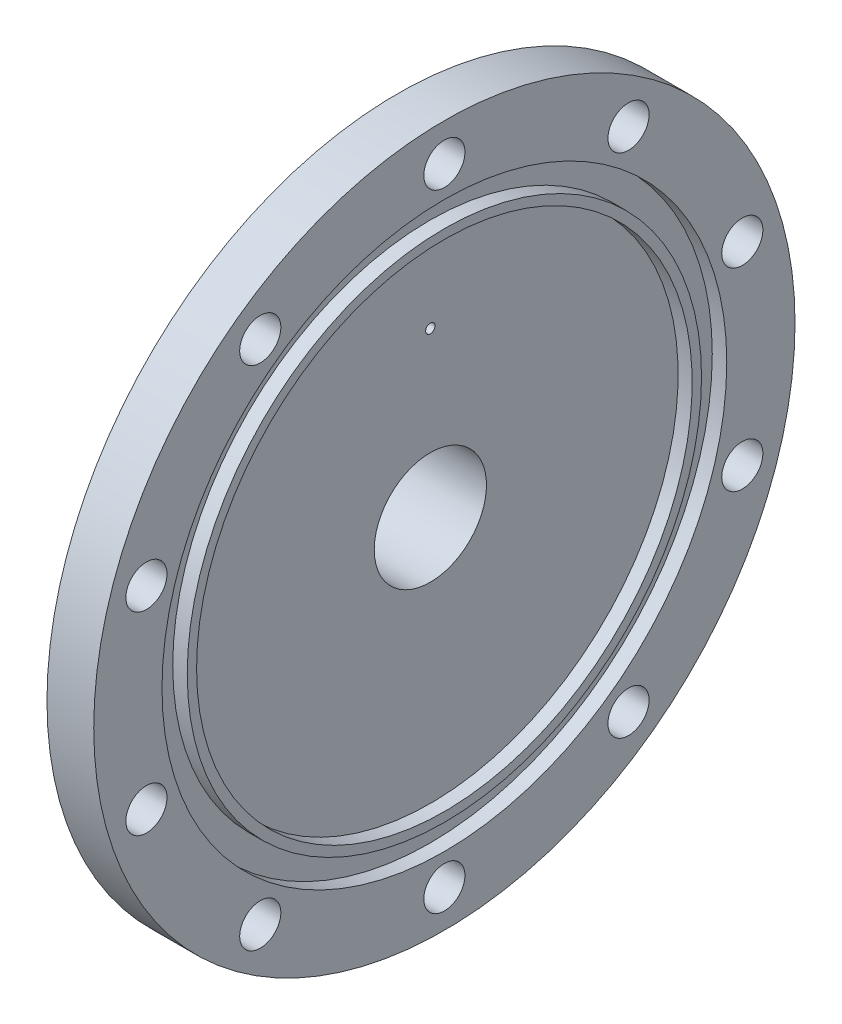
ISO-10303-21;
HEADER;
FILE_DESCRIPTION(('STEP AP214'),'2;1');
FILE_NAME('part.step','',(''),(''),'','','');
FILE_SCHEMA(('AUTOMOTIVE_DESIGN { 1 0 10303 214 1 1 1 1 }'));
ENDSEC;
DATA;
#1=APPLICATION_CONTEXT('core data for automotive mechanical design processes');
#2=APPLICATION_PROTOCOL_DEFINITION('international standard','automotive_design',2000,#1);
#3=PRODUCT_CONTEXT('',#1,'mechanical');
#4=PRODUCT('Part','Part','',(#3));
#5=PRODUCT_RELATED_PRODUCT_CATEGORY('part','',(#4));
#6=PRODUCT_DEFINITION_FORMATION('','',#4);
#7=PRODUCT_DEFINITION_CONTEXT('part definition',#1,'design');
#8=PRODUCT_DEFINITION('design','',#6,#7);
#9=PRODUCT_DEFINITION_SHAPE('','',#8);
#10=(LENGTH_UNIT() NAMED_UNIT(*) SI_UNIT(.MILLI.,.METRE.));
#11=(NAMED_UNIT(*) PLANE_ANGLE_UNIT() SI_UNIT($,.RADIAN.));
#12=(NAMED_UNIT(*) SI_UNIT($,.STERADIAN.) SOLID_ANGLE_UNIT());
#13=UNCERTAINTY_MEASURE_WITH_UNIT(LENGTH_MEASURE(1.E-05),#10,'distance_accuracy_value','');
#14=(GEOMETRIC_REPRESENTATION_CONTEXT(3) GLOBAL_UNCERTAINTY_ASSIGNED_CONTEXT((#13)) GLOBAL_UNIT_ASSIGNED_CONTEXT((#10,
#11,#12)) REPRESENTATION_CONTEXT('',''));
#15=CARTESIAN_POINT('',(0.,0.,0.));
#16=DIRECTION('',(0.,0.,1.));
#17=DIRECTION('',(1.,0.,0.));
#18=AXIS2_PLACEMENT_3D('',#15,#16,#17);
#19=CARTESIAN_POINT('',(0.,12.,0.));
#20=DIRECTION('',(1.,0.,0.));
#21=DIRECTION('',(0.,0.,-1.));
#22=AXIS2_PLACEMENT_3D('',#19,#20,#21);
#23=PLANE('',#22);
#24=CARTESIAN_POINT('',(0.,9.00000000000018,15.5884572681198));
#25=DIRECTION('',(-1.,0.,0.));
#26=DIRECTION('',(0.,-0.866025403784433,0.50000000000001));
#27=AXIS2_PLACEMENT_3D('',#24,#25,#26);
#28=CIRCLE('',#27,2.1);
#29=CARTESIAN_POINT('',(0.,7.18134665205287,16.6384572681198));
#30=VERTEX_POINT('',#29);
#31=EDGE_CURVE('E174',#30,#30,#28,.T.);
#32=ORIENTED_EDGE('',*,*,#31,.F.);
#33=EDGE_LOOP('',(#32));
#34=FACE_BOUND('',#33,.T.);
#35=CARTESIAN_POINT('',(0.,-8.99999999999985,15.58845726812));
#36=DIRECTION('',(-1.,0.,0.));
#37=DIRECTION('',(0.,-0.866025403784443,-0.499999999999992));
#38=AXIS2_PLACEMENT_3D('',#35,#36,#37);
#39=CIRCLE('',#38,2.1);
#40=CARTESIAN_POINT('',(0.,-10.8186533479472,14.53845726812));
#41=VERTEX_POINT('',#40);
#42=EDGE_CURVE('E191',#41,#41,#39,.T.);
#43=ORIENTED_EDGE('',*,*,#42,.F.);
#44=EDGE_LOOP('',(#43));
#45=FACE_BOUND('',#44,.T.);
#46=CARTESIAN_POINT('',(0.,-18.,0.));
#47=DIRECTION('',(-1.,0.,0.));
#48=DIRECTION('',(0.,0.,-1.));
#49=AXIS2_PLACEMENT_3D('',#46,#47,#48);
#50=CIRCLE('',#49,2.1);
#51=CARTESIAN_POINT('',(0.,-18.,-2.1));
#52=VERTEX_POINT('',#51);
#53=EDGE_CURVE('E185',#52,#52,#50,.T.);
#54=ORIENTED_EDGE('',*,*,#53,.F.);
#55=EDGE_LOOP('',(#54));
#56=FACE_BOUND('',#55,.T.);
#57=CARTESIAN_POINT('',(0.,-9.00000000000007,-15.5884572681199));
#58=DIRECTION('',(-1.,0.,0.));
#59=DIRECTION('',(0.,0.866025403784436,-0.500000000000004));
#60=AXIS2_PLACEMENT_3D('',#57,#58,#59);
#61=CIRCLE('',#60,2.1);
#62=CARTESIAN_POINT('',(0.,-7.18134665205276,-16.6384572681199));
#63=VERTEX_POINT('',#62);
#64=EDGE_CURVE('E179',#63,#63,#61,.T.);
#65=ORIENTED_EDGE('',*,*,#64,.F.);
#66=EDGE_LOOP('',(#65));
#67=FACE_BOUND('',#66,.T.);
#68=CARTESIAN_POINT('',(0.,8.99999999999996,-15.5884572681199));
#69=DIRECTION('',(-1.,0.,0.));
#70=DIRECTION('',(0.,0.86602540378444,0.499999999999998));
#71=AXIS2_PLACEMENT_3D('',#68,#69,#70);
#72=CIRCLE('',#71,2.1);
#73=CARTESIAN_POINT('',(0.,10.8186533479473,-14.5384572681199));
#74=VERTEX_POINT('',#73);
#75=EDGE_CURVE('E178',#74,#74,#72,.T.);
#76=ORIENTED_EDGE('',*,*,#75,.F.);
#77=EDGE_LOOP('',(#76));
#78=FACE_BOUND('',#77,.T.);
#79=CARTESIAN_POINT('',(0.,18.,0.));
#80=DIRECTION('',(-1.,0.,0.));
#81=DIRECTION('',(0.,0.,1.));
#82=AXIS2_PLACEMENT_3D('',#79,#80,#81);
#83=CIRCLE('',#82,2.1);
#84=CARTESIAN_POINT('',(0.,18.,2.1));
#85=VERTEX_POINT('',#84);
#86=EDGE_CURVE('E202',#85,#85,#83,.T.);
#87=ORIENTED_EDGE('',*,*,#86,.F.);
#88=EDGE_LOOP('',(#87));
#89=FACE_BOUND('',#88,.T.);
#90=CARTESIAN_POINT('',(0.,0.,0.));
#91=DIRECTION('',(-1.,0.,0.));
#92=DIRECTION('',(0.,0.,1.));
#93=AXIS2_PLACEMENT_3D('',#90,#91,#92);
#94=CIRCLE('',#93,12.);
#95=CARTESIAN_POINT('',(0.,0.,12.));
#96=VERTEX_POINT('',#95);
#97=EDGE_CURVE('E208',#96,#96,#94,.T.);
#98=ORIENTED_EDGE('',*,*,#97,.F.);
#99=EDGE_LOOP('',(#98));
#100=FACE_BOUND('',#99,.T.);
#101=CARTESIAN_POINT('',(0.,0.,0.));
#102=DIRECTION('',(-1.,0.,0.));
#103=DIRECTION('',(0.,0.,1.));
#104=AXIS2_PLACEMENT_3D('',#101,#102,#103);
#105=CIRCLE('',#104,24.);
#106=CARTESIAN_POINT('',(0.,9.94285714285715,-21.8435251696409));
#107=VERTEX_POINT('',#106);
#108=CARTESIAN_POINT('',(0.,9.94285714285715,21.8435251696409));
#109=VERTEX_POINT('',#108);
#110=EDGE_CURVE('E11',#107,#109,#105,.T.);
#111=ORIENTED_EDGE('',*,*,#110,.T.);
#112=DIRECTION('',(0.,0.91014688206837,-0.414285714285714));
#113=VECTOR('',#112,1.);
#114=CARTESIAN_POINT('',(0.,9.94285714285715,21.8435251696409));
#115=LINE('',#114,#113);
#116=CARTESIAN_POINT('',(0.,38.9357142857143,8.64639537964952));
#117=VERTEX_POINT('',#116);
#118=EDGE_CURVE('E78',#109,#117,#115,.T.);
#119=ORIENTED_EDGE('',*,*,#118,.T.);
#120=CARTESIAN_POINT('',(0.,35.,0.));
#121=DIRECTION('',(-1.,0.,0.));
#122=DIRECTION('',(0.,0.,1.));
#123=AXIS2_PLACEMENT_3D('',#120,#121,#122);
#124=CIRCLE('',#123,9.5);
#125=CARTESIAN_POINT('',(0.,38.9357142857143,-8.64639537964952));
#126=VERTEX_POINT('',#125);
#127=EDGE_CURVE('E82',#117,#126,#124,.T.);
#128=ORIENTED_EDGE('',*,*,#127,.T.);
#129=DIRECTION('',(0.,-0.91014688206837,-0.414285714285714));
#130=VECTOR('',#129,1.);
#131=CARTESIAN_POINT('',(0.,9.94285714285715,-21.8435251696409));
#132=LINE('',#131,#130);
#133=EDGE_CURVE('E99',#126,#107,#132,.T.);
#134=ORIENTED_EDGE('',*,*,#133,.T.);
#135=EDGE_LOOP('',(#111,#119,#128,#134));
#136=FACE_BOUND('',#135,.T.);
#137=CARTESIAN_POINT('',(0.,35.,0.));
#138=DIRECTION('',(-1.,0.,0.));
#139=DIRECTION('',(0.,0.,1.));
#140=AXIS2_PLACEMENT_3D('',#137,#138,#139);
#141=CIRCLE('',#140,5.5);
#142=CARTESIAN_POINT('',(0.,35.,5.5));
#143=VERTEX_POINT('',#142);
#144=EDGE_CURVE('E107',#143,#143,#141,.T.);
#145=ORIENTED_EDGE('',*,*,#144,.F.);
#146=EDGE_LOOP('',(#145));
#147=FACE_BOUND('',#146,.T.);
#148=ADVANCED_FACE('F41',(#34,#45,#56,#67,#78,#89,#100,#136,#147),#23,.F.);
#149=CARTESIAN_POINT('',(0.,0.,0.));
#150=DIRECTION('',(-1.,0.,0.));
#151=DIRECTION('',(0.,0.,1.));
#152=AXIS2_PLACEMENT_3D('',#149,#150,#151);
#153=CYLINDRICAL_SURFACE('',#152,24.);
#154=CARTESIAN_POINT('',(10.,0.,0.));
#155=DIRECTION('',(-1.,0.,0.));
#156=DIRECTION('',(0.,0.,1.));
#157=AXIS2_PLACEMENT_3D('',#154,#155,#156);
#158=CIRCLE('',#157,24.);
#159=CARTESIAN_POINT('',(10.,9.94285714285715,-21.8435251696409));
#160=VERTEX_POINT('',#159);
#161=CARTESIAN_POINT('',(10.,9.94285714285716,21.8435251696409));
#162=VERTEX_POINT('',#161);
#163=EDGE_CURVE('E48',#160,#162,#158,.T.);
#164=ORIENTED_EDGE('',*,*,#163,.T.);
#165=DIRECTION('',(1.,0.,0.));
#166=VECTOR('',#165,1.);
#167=CARTESIAN_POINT('',(0.,9.94285714285715,21.8435251696409));
#168=LINE('',#167,#166);
#169=EDGE_CURVE('E58',#109,#162,#168,.T.);
#170=ORIENTED_EDGE('',*,*,#169,.F.);
#171=ORIENTED_EDGE('',*,*,#110,.F.);
#172=DIRECTION('',(1.,0.,0.));
#173=VECTOR('',#172,1.);
#174=CARTESIAN_POINT('',(0.,9.94285714285715,-21.8435251696409));
#175=LINE('',#174,#173);
#176=EDGE_CURVE('E101',#107,#160,#175,.T.);
#177=ORIENTED_EDGE('',*,*,#176,.T.);
#178=EDGE_LOOP('',(#164,#170,#171,#177));
#179=FACE_BOUND('',#178,.T.);
#180=ADVANCED_FACE('F239',(#179),#153,.T.);
#181=CARTESIAN_POINT('',(10.,24.,0.));
#182=DIRECTION('',(1.,0.,0.));
#183=DIRECTION('',(0.,0.,-1.));
#184=AXIS2_PLACEMENT_3D('',#181,#182,#183);
#185=PLANE('',#184);
#186=DIRECTION('',(0.,0.91014688206837,-0.414285714285714));
#187=VECTOR('',#186,1.);
#188=CARTESIAN_POINT('',(10.,9.94285714285715,21.8435251696409));
#189=LINE('',#188,#187);
#190=CARTESIAN_POINT('',(10.,38.9357142857143,8.64639537964952));
#191=VERTEX_POINT('',#190);
#192=EDGE_CURVE('E91',#162,#191,#189,.T.);
#193=ORIENTED_EDGE('',*,*,#192,.F.);
#194=ORIENTED_EDGE('',*,*,#163,.F.);
#195=DIRECTION('',(0.,-0.91014688206837,-0.414285714285714));
#196=VECTOR('',#195,1.);
#197=CARTESIAN_POINT('',(10.,9.94285714285715,-21.8435251696409));
#198=LINE('',#197,#196);
#199=CARTESIAN_POINT('',(10.,38.9357142857143,-8.64639537964951));
#200=VERTEX_POINT('',#199);
#201=EDGE_CURVE('E85',#200,#160,#198,.T.);
#202=ORIENTED_EDGE('',*,*,#201,.F.);
#203=CARTESIAN_POINT('',(10.,35.,0.));
#204=DIRECTION('',(-1.,0.,0.));
#205=DIRECTION('',(0.,0.,1.));
#206=AXIS2_PLACEMENT_3D('',#203,#204,#205);
#207=CIRCLE('',#206,9.5);
#208=EDGE_CURVE('E106',#191,#200,#207,.T.);
#209=ORIENTED_EDGE('',*,*,#208,.F.);
#210=EDGE_LOOP('',(#193,#194,#202,#209));
#211=FACE_BOUND('',#210,.T.);
#212=CARTESIAN_POINT('',(10.,54.204138623122,39.381611903595));
#213=DIRECTION('',(-1.,0.,0.));
#214=DIRECTION('',(0.,-0.587785252292462,0.809016994374955));
#215=AXIS2_PLACEMENT_3D('',#212,#213,#214);
#216=CIRCLE('',#215,4.4);
#217=CARTESIAN_POINT('',(10.,51.6178835130352,42.9412866788448));
#218=VERTEX_POINT('',#217);
#219=EDGE_CURVE('E114',#218,#218,#216,.T.);
#220=ORIENTED_EDGE('',*,*,#219,.F.);
#221=EDGE_LOOP('',(#220));
#222=FACE_BOUND('',#221,.T.);
#223=CARTESIAN_POINT('',(10.,20.7041386231222,63.7207865917751));
#224=DIRECTION('',(-1.,0.,0.));
#225=DIRECTION('',(0.,-0.95105651629515,0.309016994374958));
#226=AXIS2_PLACEMENT_3D('',#223,#224,#225);
#227=CIRCLE('',#226,4.4);
#228=CARTESIAN_POINT('',(10.,16.5194899514235,65.0804613670249));
#229=VERTEX_POINT('',#228);
#230=EDGE_CURVE('E153',#229,#229,#227,.T.);
#231=ORIENTED_EDGE('',*,*,#230,.F.);
#232=EDGE_LOOP('',(#231));
#233=FACE_BOUND('',#232,.T.);
#234=CARTESIAN_POINT('',(10.,-20.7041386231209,63.7207865917755));
#235=DIRECTION('',(-1.,0.,0.));
#236=DIRECTION('',(0.,-0.951056516295157,-0.309016994374938));
#237=AXIS2_PLACEMENT_3D('',#234,#235,#236);
#238=CIRCLE('',#237,4.4);
#239=CARTESIAN_POINT('',(10.,-24.8887872948196,62.3611118165258));
#240=VERTEX_POINT('',#239);
#241=EDGE_CURVE('E147',#240,#240,#238,.T.);
#242=ORIENTED_EDGE('',*,*,#241,.F.);
#243=EDGE_LOOP('',(#242));
#244=FACE_BOUND('',#243,.T.);
#245=CARTESIAN_POINT('',(10.,-54.2041386231211,39.3816119035962));
#246=DIRECTION('',(-1.,0.,0.));
#247=DIRECTION('',(0.,-0.58778525229248,-0.809016994374942));
#248=AXIS2_PLACEMENT_3D('',#245,#246,#247);
#249=CIRCLE('',#248,4.4);
#250=CARTESIAN_POINT('',(10.,-56.790393733208,35.8219371283464));
#251=VERTEX_POINT('',#250);
#252=EDGE_CURVE('E141',#251,#251,#249,.T.);
#253=ORIENTED_EDGE('',*,*,#252,.F.);
#254=EDGE_LOOP('',(#253));
#255=FACE_BOUND('',#254,.T.);
#256=CARTESIAN_POINT('',(10.,-67.,0.));
#257=DIRECTION('',(-1.,0.,0.));
#258=DIRECTION('',(0.,0.,-1.));
#259=AXIS2_PLACEMENT_3D('',#256,#257,#258);
#260=CIRCLE('',#259,4.4);
#261=CARTESIAN_POINT('',(10.,-67.,-4.4));
#262=VERTEX_POINT('',#261);
#263=EDGE_CURVE('E135',#262,#262,#260,.T.);
#264=ORIENTED_EDGE('',*,*,#263,.F.);
#265=EDGE_LOOP('',(#264));
#266=FACE_BOUND('',#265,.T.);
#267=CARTESIAN_POINT('',(10.,-54.2041386231217,-39.3816119035954));
#268=DIRECTION('',(-1.,0.,0.));
#269=DIRECTION('',(0.,0.587785252292469,-0.809016994374951));
#270=AXIS2_PLACEMENT_3D('',#267,#268,#269);
#271=CIRCLE('',#270,4.4);
#272=CARTESIAN_POINT('',(10.,-51.6178835130348,-42.9412866788452));
#273=VERTEX_POINT('',#272);
#274=EDGE_CURVE('E129',#273,#273,#271,.T.);
#275=ORIENTED_EDGE('',*,*,#274,.F.);
#276=EDGE_LOOP('',(#275));
#277=FACE_BOUND('',#276,.T.);
#278=CARTESIAN_POINT('',(10.,-20.7041386231218,-63.7207865917752));
#279=DIRECTION('',(-1.,0.,0.));
#280=DIRECTION('',(0.,0.951056516295152,-0.309016994374952));
#281=AXIS2_PLACEMENT_3D('',#278,#279,#280);
#282=CIRCLE('',#281,4.4);
#283=CARTESIAN_POINT('',(10.,-16.5194899514231,-65.080461367025));
#284=VERTEX_POINT('',#283);
#285=EDGE_CURVE('E123',#284,#284,#282,.T.);
#286=ORIENTED_EDGE('',*,*,#285,.F.);
#287=EDGE_LOOP('',(#286));
#288=FACE_BOUND('',#287,.T.);
#289=CARTESIAN_POINT('',(10.,20.7041386231213,-63.7207865917754));
#290=DIRECTION('',(-1.,0.,0.));
#291=DIRECTION('',(0.,0.951056516295155,0.309016994374945));
#292=AXIS2_PLACEMENT_3D('',#289,#290,#291);
#293=CIRCLE('',#292,4.4);
#294=CARTESIAN_POINT('',(10.,24.88878729482,-62.3611118165256));
#295=VERTEX_POINT('',#294);
#296=EDGE_CURVE('E115',#295,#295,#293,.T.);
#297=ORIENTED_EDGE('',*,*,#296,.F.);
#298=EDGE_LOOP('',(#297));
#299=FACE_BOUND('',#298,.T.);
#300=CARTESIAN_POINT('',(10.,54.2041386231214,-39.3816119035958));
#301=DIRECTION('',(-1.,0.,0.));
#302=DIRECTION('',(0.,0.587785252292474,0.809016994374947));
#303=AXIS2_PLACEMENT_3D('',#300,#301,#302);
#304=CIRCLE('',#303,4.4);
#305=CARTESIAN_POINT('',(10.,56.7903937332083,-35.821937128346));
#306=VERTEX_POINT('',#305);
#307=EDGE_CURVE('E122',#306,#306,#304,.T.);
#308=ORIENTED_EDGE('',*,*,#307,.F.);
#309=EDGE_LOOP('',(#308));
#310=FACE_BOUND('',#309,.T.);
#311=CARTESIAN_POINT('',(10.,67.,0.));
#312=DIRECTION('',(-1.,0.,0.));
#313=DIRECTION('',(0.,0.,1.));
#314=AXIS2_PLACEMENT_3D('',#311,#312,#313);
#315=CIRCLE('',#314,4.4);
#316=CARTESIAN_POINT('',(10.,67.,4.4));
#317=VERTEX_POINT('',#316);
#318=EDGE_CURVE('E168',#317,#317,#315,.T.);
#319=ORIENTED_EDGE('',*,*,#318,.F.);
#320=EDGE_LOOP('',(#319));
#321=FACE_BOUND('',#320,.T.);
#322=CARTESIAN_POINT('',(10.,0.,0.));
#323=DIRECTION('',(-1.,0.,0.));
#324=DIRECTION('',(0.,0.,1.));
#325=AXIS2_PLACEMENT_3D('',#322,#323,#324);
#326=CIRCLE('',#325,75.);
#327=CARTESIAN_POINT('',(10.,0.,75.));
#328=VERTEX_POINT('',#327);
#329=EDGE_CURVE('E237',#328,#328,#326,.T.);
#330=ORIENTED_EDGE('',*,*,#329,.T.);
#331=EDGE_LOOP('',(#330));
#332=FACE_BOUND('',#331,.T.);
#333=ADVANCED_FACE('F242',(#211,#222,#233,#244,#255,#266,#277,#288,#299,#310,#321,#332),#185,.F.);
#334=CARTESIAN_POINT('',(0.,0.,0.));
#335=DIRECTION('',(-1.,0.,0.));
#336=DIRECTION('',(0.,0.,1.));
#337=AXIS2_PLACEMENT_3D('',#334,#335,#336);
#338=CYLINDRICAL_SURFACE('',#337,75.);
#339=ORIENTED_EDGE('',*,*,#329,.F.);
#340=EDGE_LOOP('',(#339));
#341=FACE_BOUND('',#340,.T.);
#342=CARTESIAN_POINT('',(20.,0.,0.));
#343=DIRECTION('',(-1.,0.,0.));
#344=DIRECTION('',(0.,0.,1.));
#345=AXIS2_PLACEMENT_3D('',#342,#343,#344);
#346=CIRCLE('',#345,75.);
#347=CARTESIAN_POINT('',(20.,0.,75.));
#348=VERTEX_POINT('',#347);
#349=EDGE_CURVE('E234',#348,#348,#346,.T.);
#350=ORIENTED_EDGE('',*,*,#349,.T.);
#351=EDGE_LOOP('',(#350));
#352=FACE_BOUND('',#351,.T.);
#353=ADVANCED_FACE('F318',(#341,#352),#338,.T.);
#354=CARTESIAN_POINT('',(20.,75.,0.));
#355=DIRECTION('',(-1.,0.,0.));
#356=DIRECTION('',(0.,0.,1.));
#357=AXIS2_PLACEMENT_3D('',#354,#355,#356);
#358=PLANE('',#357);
#359=CARTESIAN_POINT('',(20.,54.204138623122,39.381611903595));
#360=DIRECTION('',(-1.,0.,0.));
#361=DIRECTION('',(0.,0.,1.));
#362=AXIS2_PLACEMENT_3D('',#359,#360,#361);
#363=CIRCLE('',#362,4.4);
#364=CARTESIAN_POINT('',(20.,54.204138623122,43.781611903595));
#365=VERTEX_POINT('',#364);
#366=EDGE_CURVE('E156',#365,#365,#363,.F.);
#367=ORIENTED_EDGE('',*,*,#366,.F.);
#368=EDGE_LOOP('',(#367));
#369=FACE_BOUND('',#368,.T.);
#370=CARTESIAN_POINT('',(20.,20.7041386231222,63.7207865917751));
#371=DIRECTION('',(-1.,0.,0.));
#372=DIRECTION('',(0.,0.,1.));
#373=AXIS2_PLACEMENT_3D('',#370,#371,#372);
#374=CIRCLE('',#373,4.4);
#375=CARTESIAN_POINT('',(20.,20.7041386231222,68.1207865917751));
#376=VERTEX_POINT('',#375);
#377=EDGE_CURVE('E150',#376,#376,#374,.F.);
#378=ORIENTED_EDGE('',*,*,#377,.F.);
#379=EDGE_LOOP('',(#378));
#380=FACE_BOUND('',#379,.T.);
#381=CARTESIAN_POINT('',(20.,-20.7041386231209,63.7207865917755));
#382=DIRECTION('',(-1.,0.,0.));
#383=DIRECTION('',(0.,0.,1.));
#384=AXIS2_PLACEMENT_3D('',#381,#382,#383);
#385=CIRCLE('',#384,4.4);
#386=CARTESIAN_POINT('',(20.,-20.7041386231209,68.1207865917755));
#387=VERTEX_POINT('',#386);
#388=EDGE_CURVE('E144',#387,#387,#385,.F.);
#389=ORIENTED_EDGE('',*,*,#388,.F.);
#390=EDGE_LOOP('',(#389));
#391=FACE_BOUND('',#390,.T.);
#392=CARTESIAN_POINT('',(20.,-54.2041386231211,39.3816119035962));
#393=DIRECTION('',(-1.,0.,0.));
#394=DIRECTION('',(0.,0.,1.));
#395=AXIS2_PLACEMENT_3D('',#392,#393,#394);
#396=CIRCLE('',#395,4.4);
#397=CARTESIAN_POINT('',(20.,-54.2041386231211,43.7816119035962));
#398=VERTEX_POINT('',#397);
#399=EDGE_CURVE('E138',#398,#398,#396,.F.);
#400=ORIENTED_EDGE('',*,*,#399,.F.);
#401=EDGE_LOOP('',(#400));
#402=FACE_BOUND('',#401,.T.);
#403=CARTESIAN_POINT('',(20.,-67.,0.));
#404=DIRECTION('',(-1.,0.,0.));
#405=DIRECTION('',(0.,0.,1.));
#406=AXIS2_PLACEMENT_3D('',#403,#404,#405);
#407=CIRCLE('',#406,4.4);
#408=CARTESIAN_POINT('',(20.,-67.,4.4));
#409=VERTEX_POINT('',#408);
#410=EDGE_CURVE('E132',#409,#409,#407,.F.);
#411=ORIENTED_EDGE('',*,*,#410,.F.);
#412=EDGE_LOOP('',(#411));
#413=FACE_BOUND('',#412,.T.);
#414=CARTESIAN_POINT('',(20.,-54.2041386231217,-39.3816119035954));
#415=DIRECTION('',(-1.,0.,0.));
#416=DIRECTION('',(0.,0.,1.));
#417=AXIS2_PLACEMENT_3D('',#414,#415,#416);
#418=CIRCLE('',#417,4.4);
#419=CARTESIAN_POINT('',(20.,-54.2041386231217,-34.9816119035954));
#420=VERTEX_POINT('',#419);
#421=EDGE_CURVE('E126',#420,#420,#418,.F.);
#422=ORIENTED_EDGE('',*,*,#421,.F.);
#423=EDGE_LOOP('',(#422));
#424=FACE_BOUND('',#423,.T.);
#425=CARTESIAN_POINT('',(20.,-20.7041386231218,-63.7207865917752));
#426=DIRECTION('',(-1.,0.,0.));
#427=DIRECTION('',(0.,0.,1.));
#428=AXIS2_PLACEMENT_3D('',#425,#426,#427);
#429=CIRCLE('',#428,4.4);
#430=CARTESIAN_POINT('',(20.,-20.7041386231218,-59.3207865917752));
#431=VERTEX_POINT('',#430);
#432=EDGE_CURVE('E119',#431,#431,#429,.F.);
#433=ORIENTED_EDGE('',*,*,#432,.F.);
#434=EDGE_LOOP('',(#433));
#435=FACE_BOUND('',#434,.T.);
#436=CARTESIAN_POINT('',(20.,20.7041386231213,-63.7207865917754));
#437=DIRECTION('',(-1.,0.,0.));
#438=DIRECTION('',(0.,0.,1.));
#439=AXIS2_PLACEMENT_3D('',#436,#437,#438);
#440=CIRCLE('',#439,4.4);
#441=CARTESIAN_POINT('',(20.,20.7041386231213,-59.3207865917754));
#442=VERTEX_POINT('',#441);
#443=EDGE_CURVE('E118',#442,#442,#440,.F.);
#444=ORIENTED_EDGE('',*,*,#443,.F.);
#445=EDGE_LOOP('',(#444));
#446=FACE_BOUND('',#445,.T.);
#447=CARTESIAN_POINT('',(20.,54.2041386231214,-39.3816119035958));
#448=DIRECTION('',(-1.,0.,0.));
#449=DIRECTION('',(0.,0.,1.));
#450=AXIS2_PLACEMENT_3D('',#447,#448,#449);
#451=CIRCLE('',#450,4.4);
#452=CARTESIAN_POINT('',(20.,54.2041386231214,-34.9816119035958));
#453=VERTEX_POINT('',#452);
#454=EDGE_CURVE('E165',#453,#453,#451,.F.);
#455=ORIENTED_EDGE('',*,*,#454,.F.);
#456=EDGE_LOOP('',(#455));
#457=FACE_BOUND('',#456,.T.);
#458=CARTESIAN_POINT('',(20.,67.,0.));
#459=DIRECTION('',(-1.,0.,0.));
#460=DIRECTION('',(0.,0.,1.));
#461=AXIS2_PLACEMENT_3D('',#458,#459,#460);
#462=CIRCLE('',#461,4.4);
#463=CARTESIAN_POINT('',(20.,67.,4.4));
#464=VERTEX_POINT('',#463);
#465=EDGE_CURVE('E171',#464,#464,#462,.F.);
#466=ORIENTED_EDGE('',*,*,#465,.F.);
#467=EDGE_LOOP('',(#466));
#468=FACE_BOUND('',#467,.T.);
#469=ORIENTED_EDGE('',*,*,#349,.F.);
#470=EDGE_LOOP('',(#469));
#471=FACE_BOUND('',#470,.T.);
#472=CARTESIAN_POINT('',(20.,0.,0.));
#473=DIRECTION('',(-1.,0.,0.));
#474=DIRECTION('',(0.,0.,1.));
#475=AXIS2_PLACEMENT_3D('',#472,#473,#474);
#476=CIRCLE('',#475,60.4);
#477=CARTESIAN_POINT('',(20.,0.,60.4));
#478=VERTEX_POINT('',#477);
#479=EDGE_CURVE('E231',#478,#478,#476,.T.);
#480=ORIENTED_EDGE('',*,*,#479,.T.);
#481=EDGE_LOOP('',(#480));
#482=FACE_BOUND('',#481,.T.);
#483=ADVANCED_FACE('F314',(#369,#380,#391,#402,#413,#424,#435,#446,#457,#468,#471,#482),#358,.F.);
#484=CARTESIAN_POINT('',(0.,0.,0.));
#485=DIRECTION('',(-1.,0.,0.));
#486=DIRECTION('',(0.,0.,1.));
#487=AXIS2_PLACEMENT_3D('',#484,#485,#486);
#488=CYLINDRICAL_SURFACE('',#487,60.4);
#489=ORIENTED_EDGE('',*,*,#479,.F.);
#490=EDGE_LOOP('',(#489));
#491=FACE_BOUND('',#490,.T.);
#492=CARTESIAN_POINT('',(16.9,0.,0.));
#493=DIRECTION('',(-1.,0.,0.));
#494=DIRECTION('',(0.,0.,1.));
#495=AXIS2_PLACEMENT_3D('',#492,#493,#494);
#496=CIRCLE('',#495,60.4);
#497=CARTESIAN_POINT('',(16.9,0.,60.4));
#498=VERTEX_POINT('',#497);
#499=EDGE_CURVE('E228',#498,#498,#496,.T.);
#500=ORIENTED_EDGE('',*,*,#499,.T.);
#501=EDGE_LOOP('',(#500));
#502=FACE_BOUND('',#501,.T.);
#503=ADVANCED_FACE('F310',(#491,#502),#488,.F.);
#504=CARTESIAN_POINT('',(16.9,55.,0.));
#505=DIRECTION('',(-1.,0.,0.));
#506=DIRECTION('',(0.,0.,1.));
#507=AXIS2_PLACEMENT_3D('',#504,#505,#506);
#508=PLANE('',#507);
#509=ORIENTED_EDGE('',*,*,#499,.F.);
#510=EDGE_LOOP('',(#509));
#511=FACE_BOUND('',#510,.T.);
#512=CARTESIAN_POINT('',(16.9,0.,0.));
#513=DIRECTION('',(-1.,0.,0.));
#514=DIRECTION('',(0.,0.,1.));
#515=AXIS2_PLACEMENT_3D('',#512,#513,#514);
#516=CIRCLE('',#515,55.);
#517=CARTESIAN_POINT('',(16.9,0.,55.));
#518=VERTEX_POINT('',#517);
#519=EDGE_CURVE('E225',#518,#518,#516,.T.);
#520=ORIENTED_EDGE('',*,*,#519,.T.);
#521=EDGE_LOOP('',(#520));
#522=FACE_BOUND('',#521,.T.);
#523=ADVANCED_FACE('F306',(#511,#522),#508,.F.);
#524=CARTESIAN_POINT('',(0.,0.,0.));
#525=DIRECTION('',(-1.,0.,0.));
#526=DIRECTION('',(0.,0.,1.));
#527=AXIS2_PLACEMENT_3D('',#524,#525,#526);
#528=CYLINDRICAL_SURFACE('',#527,55.);
#529=ORIENTED_EDGE('',*,*,#519,.F.);
#530=EDGE_LOOP('',(#529));
#531=FACE_BOUND('',#530,.T.);
#532=CARTESIAN_POINT('',(20.,0.,0.));
#533=DIRECTION('',(-1.,0.,0.));
#534=DIRECTION('',(0.,0.,1.));
#535=AXIS2_PLACEMENT_3D('',#532,#533,#534);
#536=CIRCLE('',#535,55.);
#537=CARTESIAN_POINT('',(20.,0.,55.));
#538=VERTEX_POINT('',#537);
#539=EDGE_CURVE('E222',#538,#538,#536,.T.);
#540=ORIENTED_EDGE('',*,*,#539,.T.);
#541=EDGE_LOOP('',(#540));
#542=FACE_BOUND('',#541,.T.);
#543=ADVANCED_FACE('F302',(#531,#542),#528,.T.);
#544=CARTESIAN_POINT('',(20.,55.,0.));
#545=DIRECTION('',(-1.,0.,0.));
#546=DIRECTION('',(0.,0.,1.));
#547=AXIS2_PLACEMENT_3D('',#544,#545,#546);
#548=PLANE('',#547);
#549=ORIENTED_EDGE('',*,*,#539,.F.);
#550=EDGE_LOOP('',(#549));
#551=FACE_BOUND('',#550,.T.);
#552=CARTESIAN_POINT('',(20.,0.,0.));
#553=DIRECTION('',(-1.,0.,0.));
#554=DIRECTION('',(0.,0.,1.));
#555=AXIS2_PLACEMENT_3D('',#552,#553,#554);
#556=CIRCLE('',#555,53.);
#557=CARTESIAN_POINT('',(20.,0.,53.));
#558=VERTEX_POINT('',#557);
#559=EDGE_CURVE('E219',#558,#558,#556,.T.);
#560=ORIENTED_EDGE('',*,*,#559,.T.);
#561=EDGE_LOOP('',(#560));
#562=FACE_BOUND('',#561,.T.);
#563=ADVANCED_FACE('F298',(#551,#562),#548,.F.);
#564=CARTESIAN_POINT('',(0.,0.,0.));
#565=DIRECTION('',(-1.,0.,0.));
#566=DIRECTION('',(0.,0.,1.));
#567=AXIS2_PLACEMENT_3D('',#564,#565,#566);
#568=CYLINDRICAL_SURFACE('',#567,53.);
#569=ORIENTED_EDGE('',*,*,#559,.F.);
#570=EDGE_LOOP('',(#569));
#571=FACE_BOUND('',#570,.T.);
#572=CARTESIAN_POINT('',(17.,0.,0.));
#573=DIRECTION('',(-1.,0.,0.));
#574=DIRECTION('',(0.,0.,1.));
#575=AXIS2_PLACEMENT_3D('',#572,#573,#574);
#576=CIRCLE('',#575,53.);
#577=CARTESIAN_POINT('',(17.,0.,53.));
#578=VERTEX_POINT('',#577);
#579=EDGE_CURVE('E216',#578,#578,#576,.T.);
#580=ORIENTED_EDGE('',*,*,#579,.T.);
#581=EDGE_LOOP('',(#580));
#582=FACE_BOUND('',#581,.T.);
#583=ADVANCED_FACE('F291',(#571,#582),#568,.F.);
#584=CARTESIAN_POINT('',(17.,53.,0.));
#585=DIRECTION('',(-1.,0.,0.));
#586=DIRECTION('',(0.,0.,1.));
#587=AXIS2_PLACEMENT_3D('',#584,#585,#586);
#588=PLANE('',#587);
#589=CARTESIAN_POINT('',(17.,35.,0.));
#590=DIRECTION('',(-1.,0.,0.));
#591=DIRECTION('',(0.,0.,1.));
#592=AXIS2_PLACEMENT_3D('',#589,#590,#591);
#593=CIRCLE('',#592,1.);
#594=CARTESIAN_POINT('',(17.,35.,1.));
#595=VERTEX_POINT('',#594);
#596=EDGE_CURVE('E384',#595,#595,#593,.F.);
#597=ORIENTED_EDGE('',*,*,#596,.F.);
#598=EDGE_LOOP('',(#597));
#599=FACE_BOUND('',#598,.T.);
#600=ORIENTED_EDGE('',*,*,#579,.F.);
#601=EDGE_LOOP('',(#600));
#602=FACE_BOUND('',#601,.T.);
#603=CARTESIAN_POINT('',(17.,0.,0.));
#604=DIRECTION('',(-1.,0.,0.));
#605=DIRECTION('',(0.,0.,1.));
#606=AXIS2_PLACEMENT_3D('',#603,#604,#605);
#607=CIRCLE('',#606,12.);
#608=CARTESIAN_POINT('',(17.,0.,12.));
#609=VERTEX_POINT('',#608);
#610=EDGE_CURVE('E213',#609,#609,#607,.T.);
#611=ORIENTED_EDGE('',*,*,#610,.T.);
#612=EDGE_LOOP('',(#611));
#613=FACE_BOUND('',#612,.T.);
#614=ADVANCED_FACE('F280',(#599,#602,#613),#588,.F.);
#615=CARTESIAN_POINT('',(0.,0.,0.));
#616=DIRECTION('',(-1.,0.,0.));
#617=DIRECTION('',(0.,0.,1.));
#618=AXIS2_PLACEMENT_3D('',#615,#616,#617);
#619=CYLINDRICAL_SURFACE('',#618,12.);
#620=ORIENTED_EDGE('',*,*,#610,.F.);
#621=EDGE_LOOP('',(#620));
#622=FACE_BOUND('',#621,.T.);
#623=ORIENTED_EDGE('',*,*,#97,.T.);
#624=EDGE_LOOP('',(#623));
#625=FACE_BOUND('',#624,.T.);
#626=ADVANCED_FACE('F277',(#622,#625),#619,.F.);
#627=CARTESIAN_POINT('',(6.,18.,0.));
#628=DIRECTION('',(-1.,0.,0.));
#629=DIRECTION('',(0.,0.,1.));
#630=AXIS2_PLACEMENT_3D('',#627,#628,#629);
#631=CYLINDRICAL_SURFACE('',#630,2.1);
#632=CARTESIAN_POINT('',(6.,18.,0.));
#633=DIRECTION('',(-1.,0.,0.));
#634=DIRECTION('',(0.,0.,1.));
#635=AXIS2_PLACEMENT_3D('',#632,#633,#634);
#636=CIRCLE('',#635,2.1);
#637=CARTESIAN_POINT('',(6.,18.,2.1));
#638=VERTEX_POINT('',#637);
#639=EDGE_CURVE('E205',#638,#638,#636,.T.);
#640=ORIENTED_EDGE('',*,*,#639,.F.);
#641=EDGE_LOOP('',(#640));
#642=FACE_BOUND('',#641,.T.);
#643=ORIENTED_EDGE('',*,*,#86,.T.);
#644=EDGE_LOOP('',(#643));
#645=FACE_BOUND('',#644,.T.);
#646=ADVANCED_FACE('F279',(#642,#645),#631,.F.);
#647=CARTESIAN_POINT('',(6.,18.,0.));
#648=DIRECTION('',(-1.,0.,0.));
#649=DIRECTION('',(0.,0.,1.));
#650=AXIS2_PLACEMENT_3D('',#647,#648,#649);
#651=PLANE('',#650);
#652=ORIENTED_EDGE('',*,*,#639,.T.);
#653=EDGE_LOOP('',(#652));
#654=FACE_BOUND('',#653,.T.);
#655=ADVANCED_FACE('F287',(#654),#651,.T.);
#656=CARTESIAN_POINT('',(6.,8.99999999999996,-15.5884572681199));
#657=DIRECTION('',(-1.,0.,0.));
#658=DIRECTION('',(0.,0.,1.));
#659=AXIS2_PLACEMENT_3D('',#656,#657,#658);
#660=CYLINDRICAL_SURFACE('',#659,2.1);
#661=CARTESIAN_POINT('',(6.,8.99999999999996,-15.5884572681199));
#662=DIRECTION('',(-1.,0.,0.));
#663=DIRECTION('',(0.,0.86602540378444,0.499999999999998));
#664=AXIS2_PLACEMENT_3D('',#661,#662,#663);
#665=CIRCLE('',#664,2.1);
#666=CARTESIAN_POINT('',(6.,10.8186533479473,-14.5384572681199));
#667=VERTEX_POINT('',#666);
#668=EDGE_CURVE('E199',#667,#667,#665,.T.);
#669=ORIENTED_EDGE('',*,*,#668,.F.);
#670=EDGE_LOOP('',(#669));
#671=FACE_BOUND('',#670,.T.);
#672=ORIENTED_EDGE('',*,*,#75,.T.);
#673=EDGE_LOOP('',(#672));
#674=FACE_BOUND('',#673,.T.);
#675=ADVANCED_FACE('F426',(#671,#674),#660,.F.);
#676=CARTESIAN_POINT('',(6.,8.99999999999996,-15.5884572681199));
#677=DIRECTION('',(-1.,0.,0.));
#678=DIRECTION('',(0.,0.86602540378444,0.499999999999998));
#679=AXIS2_PLACEMENT_3D('',#676,#677,#678);
#680=PLANE('',#679);
#681=ORIENTED_EDGE('',*,*,#668,.T.);
#682=EDGE_LOOP('',(#681));
#683=FACE_BOUND('',#682,.T.);
#684=ADVANCED_FACE('F435',(#683),#680,.T.);
#685=CARTESIAN_POINT('',(6.,-9.00000000000007,-15.5884572681199));
#686=DIRECTION('',(-1.,0.,0.));
#687=DIRECTION('',(0.,0.,1.));
#688=AXIS2_PLACEMENT_3D('',#685,#686,#687);
#689=CYLINDRICAL_SURFACE('',#688,2.1);
#690=CARTESIAN_POINT('',(6.,-9.00000000000007,-15.5884572681199));
#691=DIRECTION('',(-1.,0.,0.));
#692=DIRECTION('',(0.,0.866025403784436,-0.500000000000004));
#693=AXIS2_PLACEMENT_3D('',#690,#691,#692);
#694=CIRCLE('',#693,2.1);
#695=CARTESIAN_POINT('',(6.,-7.18134665205276,-16.6384572681199));
#696=VERTEX_POINT('',#695);
#697=EDGE_CURVE('E175',#696,#696,#694,.T.);
#698=ORIENTED_EDGE('',*,*,#697,.F.);
#699=EDGE_LOOP('',(#698));
#700=FACE_BOUND('',#699,.T.);
#701=ORIENTED_EDGE('',*,*,#64,.T.);
#702=EDGE_LOOP('',(#701));
#703=FACE_BOUND('',#702,.T.);
#704=ADVANCED_FACE('F445',(#700,#703),#689,.F.);
#705=CARTESIAN_POINT('',(6.,-9.00000000000007,-15.5884572681199));
#706=DIRECTION('',(-1.,0.,0.));
#707=DIRECTION('',(0.,0.866025403784436,-0.500000000000004));
#708=AXIS2_PLACEMENT_3D('',#705,#706,#707);
#709=PLANE('',#708);
#710=ORIENTED_EDGE('',*,*,#697,.T.);
#711=EDGE_LOOP('',(#710));
#712=FACE_BOUND('',#711,.T.);
#713=ADVANCED_FACE('F455',(#712),#709,.T.);
#714=CARTESIAN_POINT('',(6.,-18.,0.));
#715=DIRECTION('',(-1.,0.,0.));
#716=DIRECTION('',(0.,0.,1.));
#717=AXIS2_PLACEMENT_3D('',#714,#715,#716);
#718=CYLINDRICAL_SURFACE('',#717,2.1);
#719=CARTESIAN_POINT('',(6.,-18.,0.));
#720=DIRECTION('',(-1.,0.,0.));
#721=DIRECTION('',(0.,0.,-1.));
#722=AXIS2_PLACEMENT_3D('',#719,#720,#721);
#723=CIRCLE('',#722,2.1);
#724=CARTESIAN_POINT('',(6.,-18.,-2.1));
#725=VERTEX_POINT('',#724);
#726=EDGE_CURVE('E182',#725,#725,#723,.T.);
#727=ORIENTED_EDGE('',*,*,#726,.F.);
#728=EDGE_LOOP('',(#727));
#729=FACE_BOUND('',#728,.T.);
#730=ORIENTED_EDGE('',*,*,#53,.T.);
#731=EDGE_LOOP('',(#730));
#732=FACE_BOUND('',#731,.T.);
#733=ADVANCED_FACE('F465',(#729,#732),#718,.F.);
#734=CARTESIAN_POINT('',(6.,-18.,0.));
#735=DIRECTION('',(-1.,0.,0.));
#736=DIRECTION('',(0.,0.,-1.));
#737=AXIS2_PLACEMENT_3D('',#734,#735,#736);
#738=PLANE('',#737);
#739=ORIENTED_EDGE('',*,*,#726,.T.);
#740=EDGE_LOOP('',(#739));
#741=FACE_BOUND('',#740,.T.);
#742=ADVANCED_FACE('F475',(#741),#738,.T.);
#743=CARTESIAN_POINT('',(6.,-8.99999999999985,15.58845726812));
#744=DIRECTION('',(-1.,0.,0.));
#745=DIRECTION('',(0.,0.,1.));
#746=AXIS2_PLACEMENT_3D('',#743,#744,#745);
#747=CYLINDRICAL_SURFACE('',#746,2.1);
#748=CARTESIAN_POINT('',(6.,-8.99999999999985,15.58845726812));
#749=DIRECTION('',(-1.,0.,0.));
#750=DIRECTION('',(0.,-0.866025403784443,-0.499999999999992));
#751=AXIS2_PLACEMENT_3D('',#748,#749,#750);
#752=CIRCLE('',#751,2.1);
#753=CARTESIAN_POINT('',(6.,-10.8186533479472,14.53845726812));
#754=VERTEX_POINT('',#753);
#755=EDGE_CURVE('E188',#754,#754,#752,.T.);
#756=ORIENTED_EDGE('',*,*,#755,.F.);
#757=EDGE_LOOP('',(#756));
#758=FACE_BOUND('',#757,.T.);
#759=ORIENTED_EDGE('',*,*,#42,.T.);
#760=EDGE_LOOP('',(#759));
#761=FACE_BOUND('',#760,.T.);
#762=ADVANCED_FACE('F485',(#758,#761),#747,.F.);
#763=CARTESIAN_POINT('',(6.,-8.99999999999985,15.58845726812));
#764=DIRECTION('',(-1.,0.,0.));
#765=DIRECTION('',(0.,-0.866025403784443,-0.499999999999992));
#766=AXIS2_PLACEMENT_3D('',#763,#764,#765);
#767=PLANE('',#766);
#768=ORIENTED_EDGE('',*,*,#755,.T.);
#769=EDGE_LOOP('',(#768));
#770=FACE_BOUND('',#769,.T.);
#771=ADVANCED_FACE('F495',(#770),#767,.T.);
#772=CARTESIAN_POINT('',(6.,9.00000000000018,15.5884572681198));
#773=DIRECTION('',(-1.,0.,0.));
#774=DIRECTION('',(0.,0.,1.));
#775=AXIS2_PLACEMENT_3D('',#772,#773,#774);
#776=CYLINDRICAL_SURFACE('',#775,2.1);
#777=CARTESIAN_POINT('',(6.,9.00000000000018,15.5884572681198));
#778=DIRECTION('',(-1.,0.,0.));
#779=DIRECTION('',(0.,-0.866025403784433,0.50000000000001));
#780=AXIS2_PLACEMENT_3D('',#777,#778,#779);
#781=CIRCLE('',#780,2.1);
#782=CARTESIAN_POINT('',(6.,7.18134665205287,16.6384572681198));
#783=VERTEX_POINT('',#782);
#784=EDGE_CURVE('E194',#783,#783,#781,.T.);
#785=ORIENTED_EDGE('',*,*,#784,.F.);
#786=EDGE_LOOP('',(#785));
#787=FACE_BOUND('',#786,.T.);
#788=ORIENTED_EDGE('',*,*,#31,.T.);
#789=EDGE_LOOP('',(#788));
#790=FACE_BOUND('',#789,.T.);
#791=ADVANCED_FACE('F505',(#787,#790),#776,.F.);
#792=CARTESIAN_POINT('',(6.,9.00000000000018,15.5884572681198));
#793=DIRECTION('',(-1.,0.,0.));
#794=DIRECTION('',(0.,-0.866025403784433,0.50000000000001));
#795=AXIS2_PLACEMENT_3D('',#792,#793,#794);
#796=PLANE('',#795);
#797=ORIENTED_EDGE('',*,*,#784,.T.);
#798=EDGE_LOOP('',(#797));
#799=FACE_BOUND('',#798,.T.);
#800=ADVANCED_FACE('F515',(#799),#796,.T.);
#801=CARTESIAN_POINT('',(20.001,67.,0.));
#802=DIRECTION('',(-1.,0.,0.));
#803=DIRECTION('',(0.,0.,1.));
#804=AXIS2_PLACEMENT_3D('',#801,#802,#803);
#805=CYLINDRICAL_SURFACE('',#804,4.4);
#806=ORIENTED_EDGE('',*,*,#318,.T.);
#807=EDGE_LOOP('',(#806));
#808=FACE_BOUND('',#807,.T.);
#809=ORIENTED_EDGE('',*,*,#465,.T.);
#810=EDGE_LOOP('',(#809));
#811=FACE_BOUND('',#810,.T.);
#812=ADVANCED_FACE('F525',(#808,#811),#805,.F.);
#813=CARTESIAN_POINT('',(20.001,54.2041386231214,-39.3816119035958));
#814=DIRECTION('',(-1.,0.,0.));
#815=DIRECTION('',(0.,0.,1.));
#816=AXIS2_PLACEMENT_3D('',#813,#814,#815);
#817=CYLINDRICAL_SURFACE('',#816,4.4);
#818=ORIENTED_EDGE('',*,*,#307,.T.);
#819=EDGE_LOOP('',(#818));
#820=FACE_BOUND('',#819,.T.);
#821=ORIENTED_EDGE('',*,*,#454,.T.);
#822=EDGE_LOOP('',(#821));
#823=FACE_BOUND('',#822,.T.);
#824=ADVANCED_FACE('F535',(#820,#823),#817,.F.);
#825=CARTESIAN_POINT('',(20.001,20.7041386231213,-63.7207865917754));
#826=DIRECTION('',(-1.,0.,0.));
#827=DIRECTION('',(0.,0.,1.));
#828=AXIS2_PLACEMENT_3D('',#825,#826,#827);
#829=CYLINDRICAL_SURFACE('',#828,4.4);
#830=ORIENTED_EDGE('',*,*,#296,.T.);
#831=EDGE_LOOP('',(#830));
#832=FACE_BOUND('',#831,.T.);
#833=ORIENTED_EDGE('',*,*,#443,.T.);
#834=EDGE_LOOP('',(#833));
#835=FACE_BOUND('',#834,.T.);
#836=ADVANCED_FACE('F545',(#832,#835),#829,.F.);
#837=CARTESIAN_POINT('',(20.001,-20.7041386231218,-63.7207865917752));
#838=DIRECTION('',(-1.,0.,0.));
#839=DIRECTION('',(0.,0.,1.));
#840=AXIS2_PLACEMENT_3D('',#837,#838,#839);
#841=CYLINDRICAL_SURFACE('',#840,4.4);
#842=ORIENTED_EDGE('',*,*,#285,.T.);
#843=EDGE_LOOP('',(#842));
#844=FACE_BOUND('',#843,.T.);
#845=ORIENTED_EDGE('',*,*,#432,.T.);
#846=EDGE_LOOP('',(#845));
#847=FACE_BOUND('',#846,.T.);
#848=ADVANCED_FACE('F555',(#844,#847),#841,.F.);
#849=CARTESIAN_POINT('',(20.001,-54.2041386231217,-39.3816119035954));
#850=DIRECTION('',(-1.,0.,0.));
#851=DIRECTION('',(0.,0.,1.));
#852=AXIS2_PLACEMENT_3D('',#849,#850,#851);
#853=CYLINDRICAL_SURFACE('',#852,4.4);
#854=ORIENTED_EDGE('',*,*,#274,.T.);
#855=EDGE_LOOP('',(#854));
#856=FACE_BOUND('',#855,.T.);
#857=ORIENTED_EDGE('',*,*,#421,.T.);
#858=EDGE_LOOP('',(#857));
#859=FACE_BOUND('',#858,.T.);
#860=ADVANCED_FACE('F565',(#856,#859),#853,.F.);
#861=CARTESIAN_POINT('',(20.001,-67.,0.));
#862=DIRECTION('',(-1.,0.,0.));
#863=DIRECTION('',(0.,0.,1.));
#864=AXIS2_PLACEMENT_3D('',#861,#862,#863);
#865=CYLINDRICAL_SURFACE('',#864,4.4);
#866=ORIENTED_EDGE('',*,*,#263,.T.);
#867=EDGE_LOOP('',(#866));
#868=FACE_BOUND('',#867,.T.);
#869=ORIENTED_EDGE('',*,*,#410,.T.);
#870=EDGE_LOOP('',(#869));
#871=FACE_BOUND('',#870,.T.);
#872=ADVANCED_FACE('F575',(#868,#871),#865,.F.);
#873=CARTESIAN_POINT('',(20.001,-54.2041386231211,39.3816119035962));
#874=DIRECTION('',(-1.,0.,0.));
#875=DIRECTION('',(0.,0.,1.));
#876=AXIS2_PLACEMENT_3D('',#873,#874,#875);
#877=CYLINDRICAL_SURFACE('',#876,4.4);
#878=ORIENTED_EDGE('',*,*,#252,.T.);
#879=EDGE_LOOP('',(#878));
#880=FACE_BOUND('',#879,.T.);
#881=ORIENTED_EDGE('',*,*,#399,.T.);
#882=EDGE_LOOP('',(#881));
#883=FACE_BOUND('',#882,.T.);
#884=ADVANCED_FACE('F585',(#880,#883),#877,.F.);
#885=CARTESIAN_POINT('',(20.001,-20.7041386231209,63.7207865917755));
#886=DIRECTION('',(-1.,0.,0.));
#887=DIRECTION('',(0.,0.,1.));
#888=AXIS2_PLACEMENT_3D('',#885,#886,#887);
#889=CYLINDRICAL_SURFACE('',#888,4.4);
#890=ORIENTED_EDGE('',*,*,#241,.T.);
#891=EDGE_LOOP('',(#890));
#892=FACE_BOUND('',#891,.T.);
#893=ORIENTED_EDGE('',*,*,#388,.T.);
#894=EDGE_LOOP('',(#893));
#895=FACE_BOUND('',#894,.T.);
#896=ADVANCED_FACE('F595',(#892,#895),#889,.F.);
#897=CARTESIAN_POINT('',(20.001,20.7041386231222,63.7207865917751));
#898=DIRECTION('',(-1.,0.,0.));
#899=DIRECTION('',(0.,0.,1.));
#900=AXIS2_PLACEMENT_3D('',#897,#898,#899);
#901=CYLINDRICAL_SURFACE('',#900,4.4);
#902=ORIENTED_EDGE('',*,*,#230,.T.);
#903=EDGE_LOOP('',(#902));
#904=FACE_BOUND('',#903,.T.);
#905=ORIENTED_EDGE('',*,*,#377,.T.);
#906=EDGE_LOOP('',(#905));
#907=FACE_BOUND('',#906,.T.);
#908=ADVANCED_FACE('F605',(#904,#907),#901,.F.);
#909=CARTESIAN_POINT('',(20.001,54.204138623122,39.381611903595));
#910=DIRECTION('',(-1.,0.,0.));
#911=DIRECTION('',(0.,0.,1.));
#912=AXIS2_PLACEMENT_3D('',#909,#910,#911);
#913=CYLINDRICAL_SURFACE('',#912,4.4);
#914=ORIENTED_EDGE('',*,*,#219,.T.);
#915=EDGE_LOOP('',(#914));
#916=FACE_BOUND('',#915,.T.);
#917=ORIENTED_EDGE('',*,*,#366,.T.);
#918=EDGE_LOOP('',(#917));
#919=FACE_BOUND('',#918,.T.);
#920=ADVANCED_FACE('F335',(#916,#919),#913,.F.);
#921=CARTESIAN_POINT('',(0.,9.94285714285715,21.8435251696409));
#922=DIRECTION('',(0.,-0.414285714285715,-0.91014688206837));
#923=DIRECTION('',(0.,0.91014688206837,-0.414285714285715));
#924=AXIS2_PLACEMENT_3D('',#921,#922,#923);
#925=PLANE('',#924);
#926=ORIENTED_EDGE('',*,*,#192,.T.);
#927=DIRECTION('',(1.,0.,0.));
#928=VECTOR('',#927,1.);
#929=CARTESIAN_POINT('',(0.,38.9357142857143,8.64639537964952));
#930=LINE('',#929,#928);
#931=EDGE_CURVE('E89',#117,#191,#930,.T.);
#932=ORIENTED_EDGE('',*,*,#931,.F.);
#933=ORIENTED_EDGE('',*,*,#118,.F.);
#934=ORIENTED_EDGE('',*,*,#169,.T.);
#935=EDGE_LOOP('',(#926,#932,#933,#934));
#936=FACE_BOUND('',#935,.T.);
#937=ADVANCED_FACE('F90',(#936),#925,.F.);
#938=CARTESIAN_POINT('',(0.,35.,0.));
#939=DIRECTION('',(1.,0.,0.));
#940=DIRECTION('',(0.,0.,-1.));
#941=AXIS2_PLACEMENT_3D('',#938,#939,#940);
#942=CYLINDRICAL_SURFACE('',#941,9.5);
#943=ORIENTED_EDGE('',*,*,#208,.T.);
#944=DIRECTION('',(1.,0.,0.));
#945=VECTOR('',#944,1.);
#946=CARTESIAN_POINT('',(0.,38.9357142857143,-8.64639537964952));
#947=LINE('',#946,#945);
#948=EDGE_CURVE('E94',#126,#200,#947,.T.);
#949=ORIENTED_EDGE('',*,*,#948,.F.);
#950=ORIENTED_EDGE('',*,*,#127,.F.);
#951=ORIENTED_EDGE('',*,*,#931,.T.);
#952=EDGE_LOOP('',(#943,#949,#950,#951));
#953=FACE_BOUND('',#952,.T.);
#954=ADVANCED_FACE('F96',(#953),#942,.T.);
#955=CARTESIAN_POINT('',(0.,9.94285714285715,-21.8435251696409));
#956=DIRECTION('',(0.,-0.414285714285715,0.91014688206837));
#957=DIRECTION('',(0.,-0.91014688206837,-0.414285714285715));
#958=AXIS2_PLACEMENT_3D('',#955,#956,#957);
#959=PLANE('',#958);
#960=ORIENTED_EDGE('',*,*,#201,.T.);
#961=ORIENTED_EDGE('',*,*,#176,.F.);
#962=ORIENTED_EDGE('',*,*,#133,.F.);
#963=ORIENTED_EDGE('',*,*,#948,.T.);
#964=EDGE_LOOP('',(#960,#961,#962,#963));
#965=FACE_BOUND('',#964,.T.);
#966=ADVANCED_FACE('F245',(#965),#959,.F.);
#967=CARTESIAN_POINT('',(0.,35.,0.));
#968=DIRECTION('',(1.,0.,0.));
#969=DIRECTION('',(0.,0.,-1.));
#970=AXIS2_PLACEMENT_3D('',#967,#968,#969);
#971=CYLINDRICAL_SURFACE('',#970,5.5);
#972=ORIENTED_EDGE('',*,*,#144,.T.);
#973=EDGE_LOOP('',(#972));
#974=FACE_BOUND('',#973,.T.);
#975=CARTESIAN_POINT('',(13.,35.,0.));
#976=DIRECTION('',(-1.,0.,0.));
#977=DIRECTION('',(0.,0.,1.));
#978=AXIS2_PLACEMENT_3D('',#975,#976,#977);
#979=CIRCLE('',#978,5.5);
#980=CARTESIAN_POINT('',(13.,35.,5.5));
#981=VERTEX_POINT('',#980);
#982=EDGE_CURVE('E385',#981,#981,#979,.T.);
#983=ORIENTED_EDGE('',*,*,#982,.F.);
#984=EDGE_LOOP('',(#983));
#985=FACE_BOUND('',#984,.T.);
#986=ADVANCED_FACE('F247',(#974,#985),#971,.F.);
#987=CARTESIAN_POINT('',(13.,35.,0.));
#988=DIRECTION('',(-1.,0.,0.));
#989=DIRECTION('',(0.,0.,1.));
#990=AXIS2_PLACEMENT_3D('',#987,#988,#989);
#991=PLANE('',#990);
#992=CARTESIAN_POINT('',(13.,35.,0.));
#993=DIRECTION('',(-1.,0.,0.));
#994=DIRECTION('',(0.,0.,1.));
#995=AXIS2_PLACEMENT_3D('',#992,#993,#994);
#996=CIRCLE('',#995,1.);
#997=CARTESIAN_POINT('',(13.,35.,1.));
#998=VERTEX_POINT('',#997);
#999=EDGE_CURVE('E381',#998,#998,#996,.T.);
#1000=ORIENTED_EDGE('',*,*,#999,.F.);
#1001=EDGE_LOOP('',(#1000));
#1002=FACE_BOUND('',#1001,.T.);
#1003=ORIENTED_EDGE('',*,*,#982,.T.);
#1004=EDGE_LOOP('',(#1003));
#1005=FACE_BOUND('',#1004,.T.);
#1006=ADVANCED_FACE('F253',(#1002,#1005),#991,.T.);
#1007=CARTESIAN_POINT('',(20.001,35.,0.));
#1008=DIRECTION('',(-1.,0.,0.));
#1009=DIRECTION('',(0.,0.,1.));
#1010=AXIS2_PLACEMENT_3D('',#1007,#1008,#1009);
#1011=CYLINDRICAL_SURFACE('',#1010,1.);
#1012=CARTESIAN_POINT('',(13.,35.,1.));
#1013=CARTESIAN_POINT('',(13.0416666666667,35.,1.));
#1014=CARTESIAN_POINT('',(13.0833333333333,35.,1.));
#1015=CARTESIAN_POINT('',(13.1666666666667,35.,1.));
#1016=CARTESIAN_POINT('',(13.2083333333333,35.,1.));
#1017=CARTESIAN_POINT('',(13.2916666666667,35.,1.));
#1018=CARTESIAN_POINT('',(13.3333333333333,35.,1.));
#1019=CARTESIAN_POINT('',(13.4166666666667,35.,1.));
#1020=CARTESIAN_POINT('',(13.4583333333333,35.,1.));
#1021=CARTESIAN_POINT('',(13.5416666666667,35.,1.));
#1022=CARTESIAN_POINT('',(13.5833333333333,35.,1.));
#1023=CARTESIAN_POINT('',(13.6666666666667,35.,1.));
#1024=CARTESIAN_POINT('',(13.7083333333333,35.,1.));
#1025=CARTESIAN_POINT('',(13.7916666666667,35.,1.));
#1026=CARTESIAN_POINT('',(13.8333333333333,35.,1.));
#1027=CARTESIAN_POINT('',(13.9166666666667,35.,1.));
#1028=CARTESIAN_POINT('',(13.9583333333333,35.,1.));
#1029=CARTESIAN_POINT('',(14.0416666666667,35.,1.));
#1030=CARTESIAN_POINT('',(14.0833333333333,35.,1.));
#1031=CARTESIAN_POINT('',(14.1666666666667,35.,1.));
#1032=CARTESIAN_POINT('',(14.2083333333333,35.,1.));
#1033=CARTESIAN_POINT('',(14.2916666666667,35.,1.));
#1034=CARTESIAN_POINT('',(14.3333333333333,35.,1.));
#1035=CARTESIAN_POINT('',(14.4166666666667,35.,1.));
#1036=CARTESIAN_POINT('',(14.4583333333333,35.,1.));
#1037=CARTESIAN_POINT('',(14.5416666666667,35.,1.));
#1038=CARTESIAN_POINT('',(14.5833333333333,35.,1.));
#1039=CARTESIAN_POINT('',(14.6666666666667,35.,1.));
#1040=CARTESIAN_POINT('',(14.7083333333333,35.,1.));
#1041=CARTESIAN_POINT('',(14.7916666666667,35.,1.));
#1042=CARTESIAN_POINT('',(14.8333333333333,35.,1.));
#1043=CARTESIAN_POINT('',(14.9166666666667,35.,1.));
#1044=CARTESIAN_POINT('',(14.9583333333333,35.,1.));
#1045=CARTESIAN_POINT('',(15.0416666666667,35.,1.));
#1046=CARTESIAN_POINT('',(15.0833333333333,35.,1.));
#1047=CARTESIAN_POINT('',(15.1666666666667,35.,1.));
#1048=CARTESIAN_POINT('',(15.2083333333333,35.,1.));
#1049=CARTESIAN_POINT('',(15.2916666666667,35.,1.));
#1050=CARTESIAN_POINT('',(15.3333333333333,35.,1.));
#1051=CARTESIAN_POINT('',(15.4166666666667,35.,1.));
#1052=CARTESIAN_POINT('',(15.4583333333333,35.,1.));
#1053=CARTESIAN_POINT('',(15.5416666666667,35.,1.));
#1054=CARTESIAN_POINT('',(15.5833333333333,35.,1.));
#1055=CARTESIAN_POINT('',(15.6666666666667,35.,1.));
#1056=CARTESIAN_POINT('',(15.7083333333333,35.,1.));
#1057=CARTESIAN_POINT('',(15.7916666666667,35.,1.));
#1058=CARTESIAN_POINT('',(15.8333333333333,35.,1.));
#1059=CARTESIAN_POINT('',(15.9166666666667,35.,1.));
#1060=CARTESIAN_POINT('',(15.9583333333333,35.,1.));
#1061=CARTESIAN_POINT('',(16.0416666666667,35.,1.));
#1062=CARTESIAN_POINT('',(16.0833333333333,35.,1.));
#1063=CARTESIAN_POINT('',(16.1666666666667,35.,1.));
#1064=CARTESIAN_POINT('',(16.2083333333333,35.,1.));
#1065=CARTESIAN_POINT('',(16.2916666666667,35.,1.));
#1066=CARTESIAN_POINT('',(16.3333333333333,35.,1.));
#1067=CARTESIAN_POINT('',(16.4166666666667,35.,1.));
#1068=CARTESIAN_POINT('',(16.4583333333333,35.,1.));
#1069=CARTESIAN_POINT('',(16.5416666666667,35.,1.));
#1070=CARTESIAN_POINT('',(16.5833333333333,35.,1.));
#1071=CARTESIAN_POINT('',(16.6666666666667,35.,1.));
#1072=CARTESIAN_POINT('',(16.7083333333333,35.,1.));
#1073=CARTESIAN_POINT('',(16.7916666666667,35.,1.));
#1074=CARTESIAN_POINT('',(16.8333333333333,35.,1.));
#1075=CARTESIAN_POINT('',(16.9166666666667,35.,1.));
#1076=CARTESIAN_POINT('',(16.9583333333333,35.,1.));
#1077=CARTESIAN_POINT('',(17.,35.,1.));
#1078=B_SPLINE_CURVE_WITH_KNOTS('',3,(#1012,#1013,#1014,#1015,#1016,#1017,#1018,#1019,#1020,
#1021,#1022,#1023,#1024,#1025,#1026,#1027,#1028,#1029,#1030,#1031,#1032,#1033,#1034,#1035,#1036,
#1037,#1038,#1039,#1040,#1041,#1042,#1043,#1044,#1045,#1046,#1047,#1048,#1049,#1050,#1051,#1052,
#1053,#1054,#1055,#1056,#1057,#1058,#1059,#1060,#1061,#1062,#1063,#1064,#1065,#1066,#1067,#1068,
#1069,#1070,#1071,#1072,#1073,#1074,#1075,#1076,#1077),.UNSPECIFIED.,.F.,.F.,(4,2,2,2,2,2,2,2,2,
2,2,2,2,2,2,2,2,2,2,2,2,2,2,2,2,2,2,2,2,2,2,2,4),(0.,0.125,0.25,0.375,0.5,0.625000000000001,
0.750000000000001,0.875000000000001,1.,1.125,1.25,1.375,1.5,1.625,1.75,1.875,2.,2.125,2.25,
2.375,2.5,2.625,2.75,2.875,3.,3.125,3.25,3.375,3.5,3.625,3.75,3.875,4.),.UNSPECIFIED.);
#1079=EDGE_CURVE('BSEAM365',#998,#595,#1078,.T.);
#1080=ORIENTED_EDGE('',*,*,#999,.T.);
#1081=ORIENTED_EDGE('',*,*,#596,.T.);
#1082=ORIENTED_EDGE('',*,*,#1079,.T.);
#1083=ORIENTED_EDGE('',*,*,#1079,.F.);
#1084=EDGE_LOOP('',(#1080,#1082,#1081,#1083));
#1085=FACE_BOUND('',#1084,.T.);
#1086=ADVANCED_FACE('F365',(#1085),#1011,.F.);
#1087=CLOSED_SHELL('',(#148,#180,#333,#353,#483,#503,#523,#543,#563,#583,#614,#626,#646,#655,
#675,#684,#704,#713,#733,#742,#762,#771,#791,#800,#812,#824,#836,#848,#860,#872,#884,#896,#908,
#920,#937,#954,#966,#986,#1006,#1086));
#1088=MANIFOLD_SOLID_BREP('B2',#1087);
#1089=ADVANCED_BREP_SHAPE_REPRESENTATION('',(#18,#1088),#14);
#1090=SHAPE_DEFINITION_REPRESENTATION(#9,#1089);
ENDSEC;
END-ISO-10303-21;
